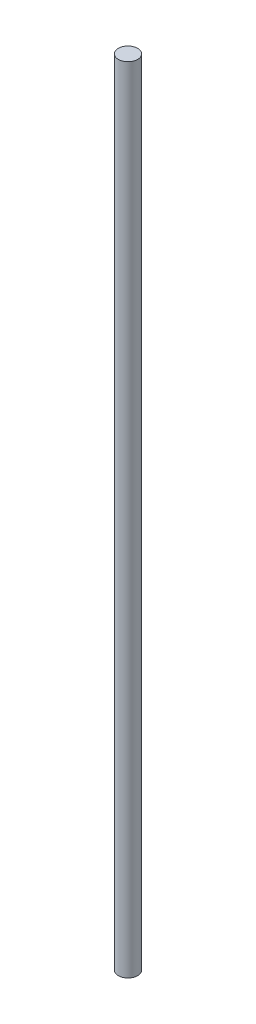
ISO-10303-21;
HEADER;
FILE_DESCRIPTION(('STEP AP214'),'2;1');
FILE_NAME('part.step','',(''),(''),'','','');
FILE_SCHEMA(('AUTOMOTIVE_DESIGN { 1 0 10303 214 1 1 1 1 }'));
ENDSEC;
DATA;
#1=APPLICATION_CONTEXT('core data for automotive mechanical design processes');
#2=APPLICATION_PROTOCOL_DEFINITION('international standard','automotive_design',2000,#1);
#3=PRODUCT_CONTEXT('',#1,'mechanical');
#4=PRODUCT('Part','Part','',(#3));
#5=PRODUCT_RELATED_PRODUCT_CATEGORY('part','',(#4));
#6=PRODUCT_DEFINITION_FORMATION('','',#4);
#7=PRODUCT_DEFINITION_CONTEXT('part definition',#1,'design');
#8=PRODUCT_DEFINITION('design','',#6,#7);
#9=PRODUCT_DEFINITION_SHAPE('','',#8);
#10=(LENGTH_UNIT() NAMED_UNIT(*) SI_UNIT(.MILLI.,.METRE.));
#11=(NAMED_UNIT(*) PLANE_ANGLE_UNIT() SI_UNIT($,.RADIAN.));
#12=(NAMED_UNIT(*) SI_UNIT($,.STERADIAN.) SOLID_ANGLE_UNIT());
#13=UNCERTAINTY_MEASURE_WITH_UNIT(LENGTH_MEASURE(1.E-05),#10,'distance_accuracy_value','');
#14=(GEOMETRIC_REPRESENTATION_CONTEXT(3) GLOBAL_UNCERTAINTY_ASSIGNED_CONTEXT((#13)) GLOBAL_UNIT_ASSIGNED_CONTEXT((#10,
#11,#12)) REPRESENTATION_CONTEXT('',''));
#15=CARTESIAN_POINT('',(0.,0.,0.));
#16=DIRECTION('',(0.,0.,1.));
#17=DIRECTION('',(1.,0.,0.));
#18=AXIS2_PLACEMENT_3D('',#15,#16,#17);
#19=CARTESIAN_POINT('',(0.,88.9,0.));
#20=DIRECTION('',(0.,-1.,0.));
#21=DIRECTION('',(0.,0.,-1.));
#22=AXIS2_PLACEMENT_3D('',#19,#20,#21);
#23=CYLINDRICAL_SURFACE('',#22,1.0795);
#24=CARTESIAN_POINT('',(0.,88.9,0.));
#25=DIRECTION('',(0.,1.,0.));
#26=DIRECTION('',(0.,0.,1.));
#27=AXIS2_PLACEMENT_3D('',#24,#25,#26);
#28=CIRCLE('',#27,1.0795);
#29=CARTESIAN_POINT('',(0.,88.9,1.0795));
#30=VERTEX_POINT('',#29);
#31=EDGE_CURVE('E10',#30,#30,#28,.T.);
#32=ORIENTED_EDGE('',*,*,#31,.F.);
#33=EDGE_LOOP('',(#32));
#34=FACE_BOUND('',#33,.T.);
#35=CARTESIAN_POINT('',(0.,0.,0.));
#36=DIRECTION('',(0.,1.,0.));
#37=DIRECTION('',(0.,0.,1.));
#38=AXIS2_PLACEMENT_3D('',#35,#36,#37);
#39=CIRCLE('',#38,1.0795);
#40=CARTESIAN_POINT('',(0.,0.,1.0795));
#41=VERTEX_POINT('',#40);
#42=EDGE_CURVE('E36',#41,#41,#39,.T.);
#43=ORIENTED_EDGE('',*,*,#42,.T.);
#44=EDGE_LOOP('',(#43));
#45=FACE_BOUND('',#44,.T.);
#46=ADVANCED_FACE('F33',(#34,#45),#23,.T.);
#47=CARTESIAN_POINT('',(0.,88.9,0.));
#48=DIRECTION('',(0.,1.,0.));
#49=DIRECTION('',(0.,0.,1.));
#50=AXIS2_PLACEMENT_3D('',#47,#48,#49);
#51=PLANE('',#50);
#52=ORIENTED_EDGE('',*,*,#31,.T.);
#53=EDGE_LOOP('',(#52));
#54=FACE_BOUND('',#53,.T.);
#55=ADVANCED_FACE('F48',(#54),#51,.T.);
#56=CARTESIAN_POINT('',(0.,0.,0.));
#57=DIRECTION('',(0.,1.,0.));
#58=DIRECTION('',(0.,0.,1.));
#59=AXIS2_PLACEMENT_3D('',#56,#57,#58);
#60=PLANE('',#59);
#61=ORIENTED_EDGE('',*,*,#42,.F.);
#62=EDGE_LOOP('',(#61));
#63=FACE_BOUND('',#62,.T.);
#64=ADVANCED_FACE('F46',(#63),#60,.F.);
#65=CLOSED_SHELL('',(#46,#55,#64));
#66=MANIFOLD_SOLID_BREP('B2',#65);
#67=ADVANCED_BREP_SHAPE_REPRESENTATION('',(#18,#66),#14);
#68=SHAPE_DEFINITION_REPRESENTATION(#9,#67);
ENDSEC;
END-ISO-10303-21;
